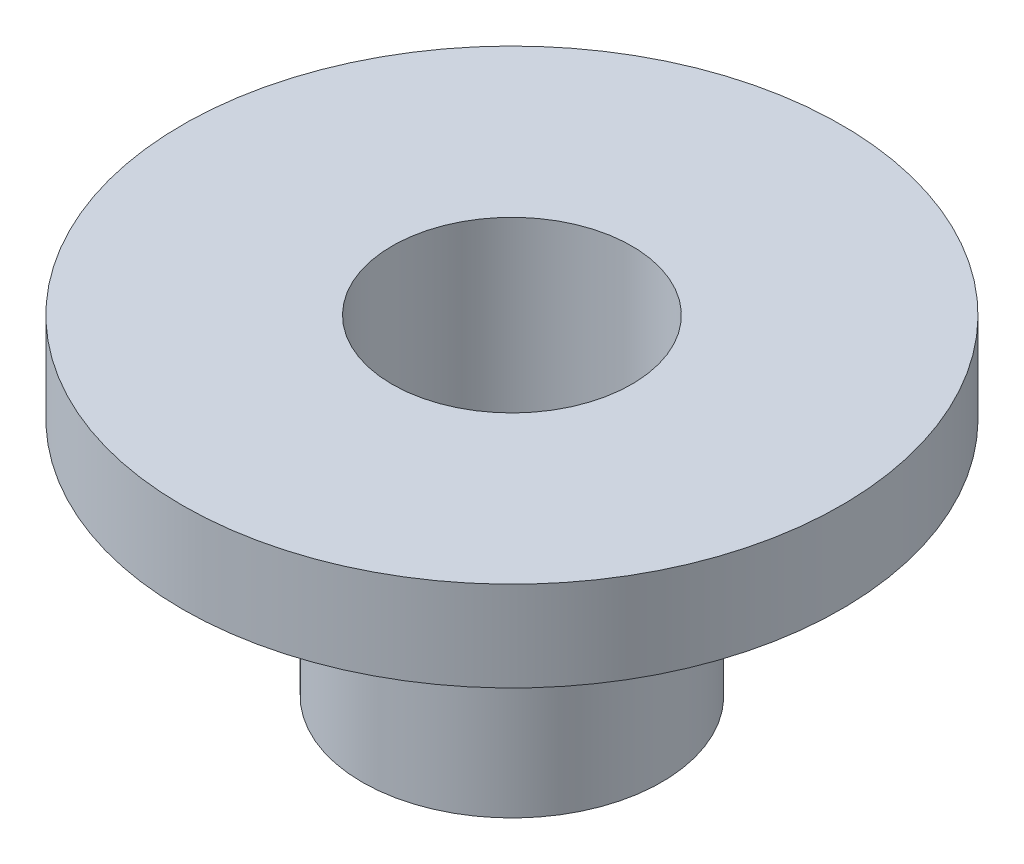
ISO-10303-21;
HEADER;
FILE_DESCRIPTION(('STEP AP214'),'2;1');
FILE_NAME('part.step','',(''),(''),'','','');
FILE_SCHEMA(('AUTOMOTIVE_DESIGN { 1 0 10303 214 1 1 1 1 }'));
ENDSEC;
DATA;
#1=APPLICATION_CONTEXT('core data for automotive mechanical design processes');
#2=APPLICATION_PROTOCOL_DEFINITION('international standard','automotive_design',2000,#1);
#3=PRODUCT_CONTEXT('',#1,'mechanical');
#4=PRODUCT('Part','Part','',(#3));
#5=PRODUCT_RELATED_PRODUCT_CATEGORY('part','',(#4));
#6=PRODUCT_DEFINITION_FORMATION('','',#4);
#7=PRODUCT_DEFINITION_CONTEXT('part definition',#1,'design');
#8=PRODUCT_DEFINITION('design','',#6,#7);
#9=PRODUCT_DEFINITION_SHAPE('','',#8);
#10=(LENGTH_UNIT() NAMED_UNIT(*) SI_UNIT(.MILLI.,.METRE.));
#11=(NAMED_UNIT(*) PLANE_ANGLE_UNIT() SI_UNIT($,.RADIAN.));
#12=(NAMED_UNIT(*) SI_UNIT($,.STERADIAN.) SOLID_ANGLE_UNIT());
#13=UNCERTAINTY_MEASURE_WITH_UNIT(LENGTH_MEASURE(1.E-05),#10,'distance_accuracy_value','');
#14=(GEOMETRIC_REPRESENTATION_CONTEXT(3) GLOBAL_UNCERTAINTY_ASSIGNED_CONTEXT((#13)) GLOBAL_UNIT_ASSIGNED_CONTEXT((#10,
#11,#12)) REPRESENTATION_CONTEXT('',''));
#15=CARTESIAN_POINT('',(0.,0.,0.));
#16=DIRECTION('',(0.,0.,1.));
#17=DIRECTION('',(1.,0.,0.));
#18=AXIS2_PLACEMENT_3D('',#15,#16,#17);
#19=CARTESIAN_POINT('',(0.,0.,0.));
#20=DIRECTION('',(0.,1.,0.));
#21=DIRECTION('',(0.,0.,1.));
#22=AXIS2_PLACEMENT_3D('',#19,#20,#21);
#23=PLANE('',#22);
#24=CARTESIAN_POINT('',(0.,0.,0.));
#25=DIRECTION('',(0.,1.,0.));
#26=DIRECTION('',(0.,0.,1.));
#27=AXIS2_PLACEMENT_3D('',#24,#25,#26);
#28=CIRCLE('',#27,5.);
#29=CARTESIAN_POINT('',(0.,0.,5.));
#30=VERTEX_POINT('',#29);
#31=EDGE_CURVE('E39',#30,#30,#28,.T.);
#32=ORIENTED_EDGE('',*,*,#31,.F.);
#33=EDGE_LOOP('',(#32));
#34=FACE_BOUND('',#33,.T.);
#35=CARTESIAN_POINT('',(0.,0.,0.));
#36=DIRECTION('',(0.,1.,0.));
#37=DIRECTION('',(0.,0.,1.));
#38=AXIS2_PLACEMENT_3D('',#35,#36,#37);
#39=CIRCLE('',#38,4.);
#40=CARTESIAN_POINT('',(0.,0.,4.));
#41=VERTEX_POINT('',#40);
#42=EDGE_CURVE('E46',#41,#41,#39,.T.);
#43=ORIENTED_EDGE('',*,*,#42,.T.);
#44=EDGE_LOOP('',(#43));
#45=FACE_BOUND('',#44,.T.);
#46=ADVANCED_FACE('F35',(#34,#45),#23,.F.);
#47=CARTESIAN_POINT('',(0.,8.,0.));
#48=DIRECTION('',(0.,-1.,0.));
#49=DIRECTION('',(0.,0.,-1.));
#50=AXIS2_PLACEMENT_3D('',#47,#48,#49);
#51=CYLINDRICAL_SURFACE('',#50,5.);
#52=CARTESIAN_POINT('',(0.,8.,0.));
#53=DIRECTION('',(0.,1.,0.));
#54=DIRECTION('',(0.,0.,1.));
#55=AXIS2_PLACEMENT_3D('',#52,#53,#54);
#56=CIRCLE('',#55,5.);
#57=CARTESIAN_POINT('',(0.,8.,5.));
#58=VERTEX_POINT('',#57);
#59=EDGE_CURVE('E10',#58,#58,#56,.T.);
#60=ORIENTED_EDGE('',*,*,#59,.F.);
#61=EDGE_LOOP('',(#60));
#62=FACE_BOUND('',#61,.T.);
#63=ORIENTED_EDGE('',*,*,#31,.T.);
#64=EDGE_LOOP('',(#63));
#65=FACE_BOUND('',#64,.T.);
#66=ADVANCED_FACE('F37',(#62,#65),#51,.T.);
#67=CARTESIAN_POINT('',(0.,8.,0.));
#68=DIRECTION('',(0.,-1.,0.));
#69=DIRECTION('',(0.,0.,-1.));
#70=AXIS2_PLACEMENT_3D('',#67,#68,#69);
#71=CYLINDRICAL_SURFACE('',#70,4.);
#72=ORIENTED_EDGE('',*,*,#42,.F.);
#73=EDGE_LOOP('',(#72));
#74=FACE_BOUND('',#73,.T.);
#75=CARTESIAN_POINT('',(0.,11.,0.));
#76=DIRECTION('',(0.,1.,0.));
#77=DIRECTION('',(0.,0.,1.));
#78=AXIS2_PLACEMENT_3D('',#75,#76,#77);
#79=CIRCLE('',#78,4.);
#80=CARTESIAN_POINT('',(0.,11.,4.));
#81=VERTEX_POINT('',#80);
#82=EDGE_CURVE('E54',#81,#81,#79,.T.);
#83=ORIENTED_EDGE('',*,*,#82,.T.);
#84=EDGE_LOOP('',(#83));
#85=FACE_BOUND('',#84,.T.);
#86=ADVANCED_FACE('F60',(#74,#85),#71,.F.);
#87=CARTESIAN_POINT('',(0.,11.,0.));
#88=DIRECTION('',(0.,1.,0.));
#89=DIRECTION('',(0.,0.,1.));
#90=AXIS2_PLACEMENT_3D('',#87,#88,#89);
#91=PLANE('',#90);
#92=CARTESIAN_POINT('',(0.,11.,0.));
#93=DIRECTION('',(0.,1.,0.));
#94=DIRECTION('',(0.,0.,1.));
#95=AXIS2_PLACEMENT_3D('',#92,#93,#94);
#96=CIRCLE('',#95,11.);
#97=CARTESIAN_POINT('',(0.,11.,11.));
#98=VERTEX_POINT('',#97);
#99=EDGE_CURVE('E50',#98,#98,#96,.T.);
#100=ORIENTED_EDGE('',*,*,#99,.T.);
#101=EDGE_LOOP('',(#100));
#102=FACE_BOUND('',#101,.T.);
#103=ORIENTED_EDGE('',*,*,#82,.F.);
#104=EDGE_LOOP('',(#103));
#105=FACE_BOUND('',#104,.T.);
#106=ADVANCED_FACE('F62',(#102,#105),#91,.T.);
#107=CARTESIAN_POINT('',(0.,8.,0.));
#108=DIRECTION('',(0.,1.,0.));
#109=DIRECTION('',(0.,0.,1.));
#110=AXIS2_PLACEMENT_3D('',#107,#108,#109);
#111=PLANE('',#110);
#112=ORIENTED_EDGE('',*,*,#59,.T.);
#113=EDGE_LOOP('',(#112));
#114=FACE_BOUND('',#113,.T.);
#115=CARTESIAN_POINT('',(0.,8.,0.));
#116=DIRECTION('',(0.,1.,0.));
#117=DIRECTION('',(0.,0.,1.));
#118=AXIS2_PLACEMENT_3D('',#115,#116,#117);
#119=CIRCLE('',#118,11.);
#120=CARTESIAN_POINT('',(0.,8.,11.));
#121=VERTEX_POINT('',#120);
#122=EDGE_CURVE('E51',#121,#121,#119,.T.);
#123=ORIENTED_EDGE('',*,*,#122,.F.);
#124=EDGE_LOOP('',(#123));
#125=FACE_BOUND('',#124,.T.);
#126=ADVANCED_FACE('F64',(#114,#125),#111,.F.);
#127=CARTESIAN_POINT('',(0.,11.,0.));
#128=DIRECTION('',(0.,-1.,0.));
#129=DIRECTION('',(0.,0.,-1.));
#130=AXIS2_PLACEMENT_3D('',#127,#128,#129);
#131=CYLINDRICAL_SURFACE('',#130,11.);
#132=ORIENTED_EDGE('',*,*,#99,.F.);
#133=EDGE_LOOP('',(#132));
#134=FACE_BOUND('',#133,.T.);
#135=ORIENTED_EDGE('',*,*,#122,.T.);
#136=EDGE_LOOP('',(#135));
#137=FACE_BOUND('',#136,.T.);
#138=ADVANCED_FACE('F71',(#134,#137),#131,.T.);
#139=CLOSED_SHELL('',(#46,#66,#86,#106,#126,#138));
#140=MANIFOLD_SOLID_BREP('B2',#139);
#141=ADVANCED_BREP_SHAPE_REPRESENTATION('',(#18,#140),#14);
#142=SHAPE_DEFINITION_REPRESENTATION(#9,#141);
ENDSEC;
END-ISO-10303-21;
